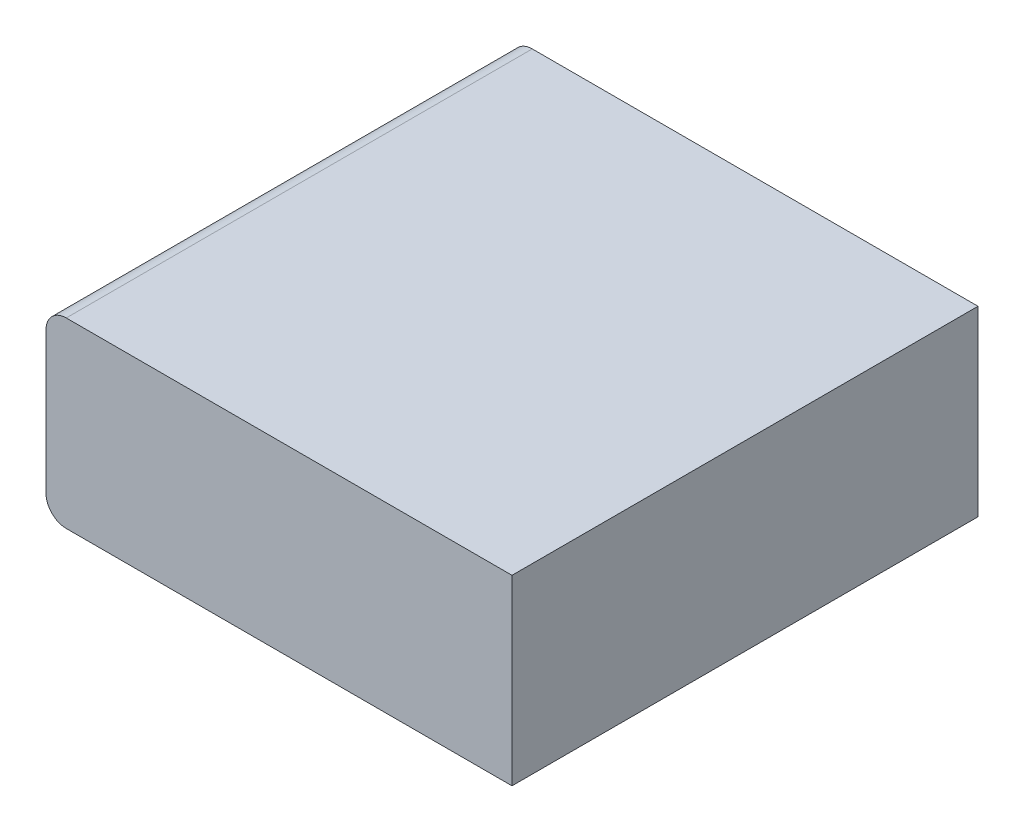
ISO-10303-21;
HEADER;
FILE_DESCRIPTION(('STEP AP214'),'2;1');
FILE_NAME('part.step','',(''),(''),'','','');
FILE_SCHEMA(('AUTOMOTIVE_DESIGN { 1 0 10303 214 1 1 1 1 }'));
ENDSEC;
DATA;
#1=APPLICATION_CONTEXT('core data for automotive mechanical design processes');
#2=APPLICATION_PROTOCOL_DEFINITION('international standard','automotive_design',2000,#1);
#3=PRODUCT_CONTEXT('',#1,'mechanical');
#4=PRODUCT('Part','Part','',(#3));
#5=PRODUCT_RELATED_PRODUCT_CATEGORY('part','',(#4));
#6=PRODUCT_DEFINITION_FORMATION('','',#4);
#7=PRODUCT_DEFINITION_CONTEXT('part definition',#1,'design');
#8=PRODUCT_DEFINITION('design','',#6,#7);
#9=PRODUCT_DEFINITION_SHAPE('','',#8);
#10=(LENGTH_UNIT() NAMED_UNIT(*) SI_UNIT(.MILLI.,.METRE.));
#11=(NAMED_UNIT(*) PLANE_ANGLE_UNIT() SI_UNIT($,.RADIAN.));
#12=(NAMED_UNIT(*) SI_UNIT($,.STERADIAN.) SOLID_ANGLE_UNIT());
#13=UNCERTAINTY_MEASURE_WITH_UNIT(LENGTH_MEASURE(1.E-05),#10,'distance_accuracy_value','');
#14=(GEOMETRIC_REPRESENTATION_CONTEXT(3) GLOBAL_UNCERTAINTY_ASSIGNED_CONTEXT((#13)) GLOBAL_UNIT_ASSIGNED_CONTEXT((#10,
#11,#12)) REPRESENTATION_CONTEXT('',''));
#15=CARTESIAN_POINT('',(0.,0.,0.));
#16=DIRECTION('',(0.,0.,1.));
#17=DIRECTION('',(1.,0.,0.));
#18=AXIS2_PLACEMENT_3D('',#15,#16,#17);
#19=CARTESIAN_POINT('',(0.,180.,0.));
#20=DIRECTION('',(1.,0.,0.));
#21=DIRECTION('',(0.,0.,-1.));
#22=AXIS2_PLACEMENT_3D('',#19,#20,#21);
#23=PLANE('',#22);
#24=DIRECTION('',(0.,-1.,0.));
#25=VECTOR('',#24,1.);
#26=CARTESIAN_POINT('',(0.,180.,-460.));
#27=LINE('',#26,#25);
#28=CARTESIAN_POINT('',(0.,160.,-460.));
#29=VERTEX_POINT('',#28);
#30=CARTESIAN_POINT('',(0.,20.,-460.));
#31=VERTEX_POINT('',#30);
#32=EDGE_CURVE('E113',#29,#31,#27,.T.);
#33=ORIENTED_EDGE('',*,*,#32,.T.);
#34=DIRECTION('',(0.,0.,1.));
#35=VECTOR('',#34,1.);
#36=CARTESIAN_POINT('',(0.,20.,0.));
#37=LINE('',#36,#35);
#38=CARTESIAN_POINT('',(0.,20.,0.));
#39=VERTEX_POINT('',#38);
#40=EDGE_CURVE('E126',#31,#39,#37,.T.);
#41=ORIENTED_EDGE('',*,*,#40,.T.);
#42=DIRECTION('',(0.,-1.,0.));
#43=VECTOR('',#42,1.);
#44=CARTESIAN_POINT('',(0.,180.,0.));
#45=LINE('',#44,#43);
#46=CARTESIAN_POINT('',(0.,160.,0.));
#47=VERTEX_POINT('',#46);
#48=EDGE_CURVE('E106',#47,#39,#45,.T.);
#49=ORIENTED_EDGE('',*,*,#48,.F.);
#50=DIRECTION('',(0.,0.,1.));
#51=VECTOR('',#50,1.);
#52=CARTESIAN_POINT('',(0.,160.,0.));
#53=LINE('',#52,#51);
#54=EDGE_CURVE('E124',#47,#29,#53,.F.);
#55=ORIENTED_EDGE('',*,*,#54,.T.);
#56=EDGE_LOOP('',(#33,#41,#49,#55));
#57=FACE_BOUND('',#56,.T.);
#58=ADVANCED_FACE('F33',(#57),#23,.F.);
#59=CARTESIAN_POINT('',(0.,180.,0.));
#60=DIRECTION('',(0.,0.,-1.));
#61=DIRECTION('',(-1.,0.,0.));
#62=AXIS2_PLACEMENT_3D('',#59,#60,#61);
#63=PLANE('',#62);
#64=ORIENTED_EDGE('',*,*,#48,.T.);
#65=CARTESIAN_POINT('',(20.,20.,0.));
#66=DIRECTION('',(0.,0.,-1.));
#67=DIRECTION('',(-1.,0.,0.));
#68=AXIS2_PLACEMENT_3D('',#65,#66,#67);
#69=CIRCLE('',#68,20.);
#70=CARTESIAN_POINT('',(20.,0.,0.));
#71=VERTEX_POINT('',#70);
#72=EDGE_CURVE('E131',#39,#71,#69,.F.);
#73=ORIENTED_EDGE('',*,*,#72,.T.);
#74=DIRECTION('',(1.,0.,0.));
#75=VECTOR('',#74,1.);
#76=CARTESIAN_POINT('',(0.,0.,0.));
#77=LINE('',#76,#75);
#78=CARTESIAN_POINT('',(460.,0.,0.));
#79=VERTEX_POINT('',#78);
#80=EDGE_CURVE('E103',#71,#79,#77,.T.);
#81=ORIENTED_EDGE('',*,*,#80,.T.);
#82=DIRECTION('',(0.,-1.,0.));
#83=VECTOR('',#82,1.);
#84=CARTESIAN_POINT('',(460.,180.,0.));
#85=LINE('',#84,#83);
#86=CARTESIAN_POINT('',(460.,180.,0.));
#87=VERTEX_POINT('',#86);
#88=EDGE_CURVE('E100',#87,#79,#85,.T.);
#89=ORIENTED_EDGE('',*,*,#88,.F.);
#90=DIRECTION('',(1.,0.,0.));
#91=VECTOR('',#90,1.);
#92=CARTESIAN_POINT('',(0.,180.,0.));
#93=LINE('',#92,#91);
#94=CARTESIAN_POINT('',(20.,180.,0.));
#95=VERTEX_POINT('',#94);
#96=EDGE_CURVE('E89',#95,#87,#93,.T.);
#97=ORIENTED_EDGE('',*,*,#96,.F.);
#98=CARTESIAN_POINT('',(20.,160.,0.));
#99=DIRECTION('',(0.,0.,-1.));
#100=DIRECTION('',(-1.,0.,0.));
#101=AXIS2_PLACEMENT_3D('',#98,#99,#100);
#102=CIRCLE('',#101,20.);
#103=EDGE_CURVE('E129',#95,#47,#102,.F.);
#104=ORIENTED_EDGE('',*,*,#103,.T.);
#105=EDGE_LOOP('',(#64,#73,#81,#89,#97,#104));
#106=FACE_BOUND('',#105,.T.);
#107=ADVANCED_FACE('F102',(#106),#63,.F.);
#108=CARTESIAN_POINT('',(460.,180.,0.));
#109=DIRECTION('',(-1.,0.,0.));
#110=DIRECTION('',(0.,0.,1.));
#111=AXIS2_PLACEMENT_3D('',#108,#109,#110);
#112=PLANE('',#111);
#113=DIRECTION('',(0.,0.,-1.));
#114=VECTOR('',#113,1.);
#115=CARTESIAN_POINT('',(460.,0.,0.));
#116=LINE('',#115,#114);
#117=CARTESIAN_POINT('',(460.,0.,-460.));
#118=VERTEX_POINT('',#117);
#119=EDGE_CURVE('E117',#79,#118,#116,.T.);
#120=ORIENTED_EDGE('',*,*,#119,.T.);
#121=DIRECTION('',(0.,-1.,0.));
#122=VECTOR('',#121,1.);
#123=CARTESIAN_POINT('',(460.,180.,-460.));
#124=LINE('',#123,#122);
#125=CARTESIAN_POINT('',(460.,180.,-460.));
#126=VERTEX_POINT('',#125);
#127=EDGE_CURVE('E107',#126,#118,#124,.T.);
#128=ORIENTED_EDGE('',*,*,#127,.F.);
#129=DIRECTION('',(0.,0.,-1.));
#130=VECTOR('',#129,1.);
#131=CARTESIAN_POINT('',(460.,180.,0.));
#132=LINE('',#131,#130);
#133=EDGE_CURVE('E93',#87,#126,#132,.T.);
#134=ORIENTED_EDGE('',*,*,#133,.F.);
#135=ORIENTED_EDGE('',*,*,#88,.T.);
#136=EDGE_LOOP('',(#120,#128,#134,#135));
#137=FACE_BOUND('',#136,.T.);
#138=ADVANCED_FACE('F109',(#137),#112,.F.);
#139=CARTESIAN_POINT('',(0.,180.,-460.));
#140=DIRECTION('',(0.,0.,1.));
#141=DIRECTION('',(1.,0.,0.));
#142=AXIS2_PLACEMENT_3D('',#139,#140,#141);
#143=PLANE('',#142);
#144=DIRECTION('',(-1.,0.,0.));
#145=VECTOR('',#144,1.);
#146=CARTESIAN_POINT('',(0.,0.,-460.));
#147=LINE('',#146,#145);
#148=CARTESIAN_POINT('',(20.,0.,-460.));
#149=VERTEX_POINT('',#148);
#150=EDGE_CURVE('E97',#118,#149,#147,.T.);
#151=ORIENTED_EDGE('',*,*,#150,.T.);
#152=CARTESIAN_POINT('',(20.,20.,-460.));
#153=DIRECTION('',(0.,0.,1.));
#154=DIRECTION('',(1.,0.,0.));
#155=AXIS2_PLACEMENT_3D('',#152,#153,#154);
#156=CIRCLE('',#155,20.);
#157=EDGE_CURVE('E41',#149,#31,#156,.F.);
#158=ORIENTED_EDGE('',*,*,#157,.T.);
#159=ORIENTED_EDGE('',*,*,#32,.F.);
#160=CARTESIAN_POINT('',(20.,160.,-460.));
#161=DIRECTION('',(0.,0.,1.));
#162=DIRECTION('',(1.,0.,0.));
#163=AXIS2_PLACEMENT_3D('',#160,#161,#162);
#164=CIRCLE('',#163,20.);
#165=CARTESIAN_POINT('',(20.,180.,-460.));
#166=VERTEX_POINT('',#165);
#167=EDGE_CURVE('E48',#29,#166,#164,.F.);
#168=ORIENTED_EDGE('',*,*,#167,.T.);
#169=DIRECTION('',(-1.,0.,0.));
#170=VECTOR('',#169,1.);
#171=CARTESIAN_POINT('',(0.,180.,-460.));
#172=LINE('',#171,#170);
#173=EDGE_CURVE('E111',#126,#166,#172,.T.);
#174=ORIENTED_EDGE('',*,*,#173,.F.);
#175=ORIENTED_EDGE('',*,*,#127,.T.);
#176=EDGE_LOOP('',(#151,#158,#159,#168,#174,#175));
#177=FACE_BOUND('',#176,.T.);
#178=ADVANCED_FACE('F135',(#177),#143,.F.);
#179=CARTESIAN_POINT('',(0.,180.,0.));
#180=DIRECTION('',(0.,-1.,0.));
#181=DIRECTION('',(0.,0.,-1.));
#182=AXIS2_PLACEMENT_3D('',#179,#180,#181);
#183=PLANE('',#182);
#184=ORIENTED_EDGE('',*,*,#173,.T.);
#185=DIRECTION('',(0.,0.,1.));
#186=VECTOR('',#185,1.);
#187=CARTESIAN_POINT('',(20.,180.,0.));
#188=LINE('',#187,#186);
#189=EDGE_CURVE('E11',#166,#95,#188,.T.);
#190=ORIENTED_EDGE('',*,*,#189,.T.);
#191=ORIENTED_EDGE('',*,*,#96,.T.);
#192=ORIENTED_EDGE('',*,*,#133,.T.);
#193=EDGE_LOOP('',(#184,#190,#191,#192));
#194=FACE_BOUND('',#193,.T.);
#195=ADVANCED_FACE('F91',(#194),#183,.F.);
#196=CARTESIAN_POINT('',(0.,0.,0.));
#197=DIRECTION('',(0.,-1.,0.));
#198=DIRECTION('',(0.,0.,-1.));
#199=AXIS2_PLACEMENT_3D('',#196,#197,#198);
#200=PLANE('',#199);
#201=ORIENTED_EDGE('',*,*,#80,.F.);
#202=DIRECTION('',(0.,0.,1.));
#203=VECTOR('',#202,1.);
#204=CARTESIAN_POINT('',(20.,0.,-460.));
#205=LINE('',#204,#203);
#206=EDGE_CURVE('E56',#71,#149,#205,.F.);
#207=ORIENTED_EDGE('',*,*,#206,.T.);
#208=ORIENTED_EDGE('',*,*,#150,.F.);
#209=ORIENTED_EDGE('',*,*,#119,.F.);
#210=EDGE_LOOP('',(#201,#207,#208,#209));
#211=FACE_BOUND('',#210,.T.);
#212=ADVANCED_FACE('F142',(#211),#200,.T.);
#213=CARTESIAN_POINT('',(20.,20.,0.));
#214=DIRECTION('',(0.,0.,-1.));
#215=DIRECTION('',(-1.,0.,0.));
#216=AXIS2_PLACEMENT_3D('',#213,#214,#215);
#217=CYLINDRICAL_SURFACE('',#216,20.);
#218=ORIENTED_EDGE('',*,*,#157,.F.);
#219=ORIENTED_EDGE('',*,*,#206,.F.);
#220=ORIENTED_EDGE('',*,*,#72,.F.);
#221=ORIENTED_EDGE('',*,*,#40,.F.);
#222=EDGE_LOOP('',(#218,#219,#220,#221));
#223=FACE_BOUND('',#222,.T.);
#224=ADVANCED_FACE('F141',(#223),#217,.T.);
#225=CARTESIAN_POINT('',(20.,160.,0.));
#226=DIRECTION('',(0.,0.,1.));
#227=DIRECTION('',(1.,0.,0.));
#228=AXIS2_PLACEMENT_3D('',#225,#226,#227);
#229=CYLINDRICAL_SURFACE('',#228,20.);
#230=ORIENTED_EDGE('',*,*,#167,.F.);
#231=ORIENTED_EDGE('',*,*,#54,.F.);
#232=ORIENTED_EDGE('',*,*,#103,.F.);
#233=ORIENTED_EDGE('',*,*,#189,.F.);
#234=EDGE_LOOP('',(#230,#231,#232,#233));
#235=FACE_BOUND('',#234,.T.);
#236=ADVANCED_FACE('F35',(#235),#229,.T.);
#237=CLOSED_SHELL('',(#58,#107,#138,#178,#195,#212,#224,#236));
#238=MANIFOLD_SOLID_BREP('B2',#237);
#239=ADVANCED_BREP_SHAPE_REPRESENTATION('',(#18,#238),#14);
#240=SHAPE_DEFINITION_REPRESENTATION(#9,#239);
ENDSEC;
END-ISO-10303-21;
